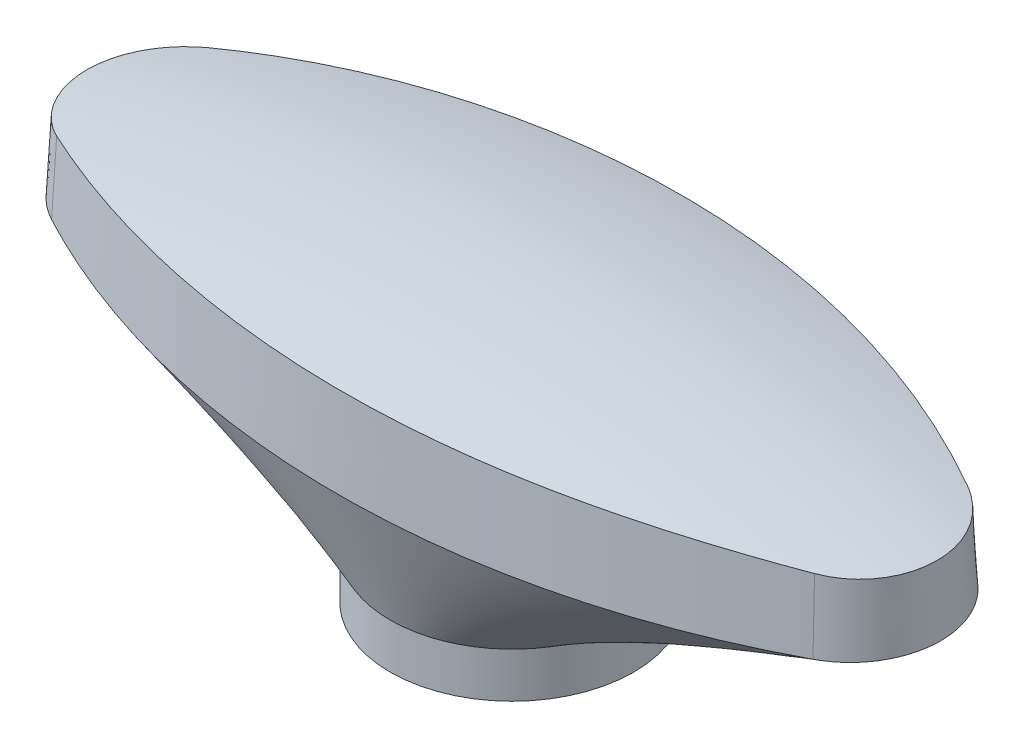
ISO-10303-21;
HEADER;
FILE_DESCRIPTION(('STEP AP214'),'2;1');
FILE_NAME('part.step','',(''),(''),'','','');
FILE_SCHEMA(('AUTOMOTIVE_DESIGN { 1 0 10303 214 1 1 1 1 }'));
ENDSEC;
DATA;
#1=APPLICATION_CONTEXT('core data for automotive mechanical design processes');
#2=APPLICATION_PROTOCOL_DEFINITION('international standard','automotive_design',2000,#1);
#3=PRODUCT_CONTEXT('',#1,'mechanical');
#4=PRODUCT('Part','Part','',(#3));
#5=PRODUCT_RELATED_PRODUCT_CATEGORY('part','',(#4));
#6=PRODUCT_DEFINITION_FORMATION('','',#4);
#7=PRODUCT_DEFINITION_CONTEXT('part definition',#1,'design');
#8=PRODUCT_DEFINITION('design','',#6,#7);
#9=PRODUCT_DEFINITION_SHAPE('','',#8);
#10=(LENGTH_UNIT() NAMED_UNIT(*) SI_UNIT(.MILLI.,.METRE.));
#11=(NAMED_UNIT(*) PLANE_ANGLE_UNIT() SI_UNIT($,.RADIAN.));
#12=(NAMED_UNIT(*) SI_UNIT($,.STERADIAN.) SOLID_ANGLE_UNIT());
#13=UNCERTAINTY_MEASURE_WITH_UNIT(LENGTH_MEASURE(1.E-05),#10,'distance_accuracy_value','');
#14=(GEOMETRIC_REPRESENTATION_CONTEXT(3) GLOBAL_UNCERTAINTY_ASSIGNED_CONTEXT((#13)) GLOBAL_UNIT_ASSIGNED_CONTEXT((#10,
#11,#12)) REPRESENTATION_CONTEXT('',''));
#15=CARTESIAN_POINT('',(0.,0.,0.));
#16=DIRECTION('',(0.,0.,1.));
#17=DIRECTION('',(1.,0.,0.));
#18=AXIS2_PLACEMENT_3D('',#15,#16,#17);
#19=CARTESIAN_POINT('',(0.,0.,70.6664701255128));
#20=DIRECTION('',(0.,-1.,0.));
#21=DIRECTION('',(0.,0.,-1.));
#22=AXIS2_PLACEMENT_3D('',#19,#20,#21);
#23=CONICAL_SURFACE('',#22,90.,0.05235987755983);
#24=CARTESIAN_POINT('',(42.1877,7.92334604528379,-8.36280484500249));
#25=CARTESIAN_POINT('',(41.0420861786236,8.04958269689081,-8.96689732359786));
#26=CARTESIAN_POINT('',(39.8827340055039,8.16554604480995,-9.54702712218328));
#27=CARTESIAN_POINT('',(37.5389979928671,8.37911484016454,-10.6578994137456));
#28=CARTESIAN_POINT('',(36.3546150847935,8.4767209693752,-11.1886437404968));
#29=CARTESIAN_POINT('',(33.9633622528988,8.65575922944964,-12.1992500164694));
#30=CARTESIAN_POINT('',(32.7564958381557,8.73719386150209,-12.6791198289132));
#31=CARTESIAN_POINT('',(30.3225011436141,8.88585861569262,-13.5868734879109));
#32=CARTESIAN_POINT('',(29.0953727194653,8.95308863658732,-14.0147569639229));
#33=CARTESIAN_POINT('',(26.6253632226318,9.07500112557227,-14.8168110909937));
#34=CARTESIAN_POINT('',(25.3825121254132,9.12970451328632,-15.191070897031));
#35=CARTESIAN_POINT('',(22.8814447587202,9.22824718567756,-15.8858501947194));
#36=CARTESIAN_POINT('',(21.6232283714051,9.27208638697934,-16.2063692739402));
#37=CARTESIAN_POINT('',(19.0939007457412,9.35022265419966,-16.7929149548736));
#38=CARTESIAN_POINT('',(17.8227898344565,9.38451996152011,-17.0589429351203));
#39=CARTESIAN_POINT('',(15.2700840785299,9.44467585432356,-17.5359110402673));
#40=CARTESIAN_POINT('',(13.9884893212943,9.47053451008813,-17.7468516239615));
#41=CARTESIAN_POINT('',(11.4721793320299,9.51374534987292,-18.1053504942601));
#42=CARTESIAN_POINT('',(10.2377997138021,9.53141367788286,-18.2552310707304));
#43=CARTESIAN_POINT('',(7.76382961184207,9.5603898825821,-18.5037746225482));
#44=CARTESIAN_POINT('',(6.52423918036235,9.57169782289894,-18.6024381102563));
#45=CARTESIAN_POINT('',(4.04200543142898,9.58833039245439,-18.748348738422));
#46=CARTESIAN_POINT('',(2.79936213473032,9.59365506225825,-18.7955962274687));
#47=CARTESIAN_POINT('',(0.313172689145865,9.59850173211197,-18.8385811807262));
#48=CARTESIAN_POINT('',(-0.930373460478781,9.59802372740787,-18.8343186027364));
#49=CARTESIAN_POINT('',(-3.41580439881277,9.59124994519686,-18.7743011758125));
#50=CARTESIAN_POINT('',(-4.65768959538659,9.58495605355588,-18.7185630184101));
#51=CARTESIAN_POINT('',(-7.13804462732119,9.56633988966191,-18.5557315805815));
#52=CARTESIAN_POINT('',(-8.37651444811628,9.55401759173923,-18.448638081478));
#53=CARTESIAN_POINT('',(-10.8478330074403,9.52293821688825,-18.1833140102447));
#54=CARTESIAN_POINT('',(-12.0806820419345,9.50418148282796,-18.025086162907));
#55=CARTESIAN_POINT('',(-14.5385798888697,9.45962556030004,-17.6578380420146));
#56=CARTESIAN_POINT('',(-15.7636288427861,9.43382649993838,-17.4488186924087));
#57=CARTESIAN_POINT('',(-19.1801673876014,9.35064667114176,-16.7929650810032));
#58=CARTESIAN_POINT('',(-21.3608596905224,9.28451113930283,-16.2896433459718));
#59=CARTESIAN_POINT('',(-25.6776417556003,9.12081285850867,-15.1230682261342));
#60=CARTESIAN_POINT('',(-27.8137362273662,9.02325344602767,-14.4598318223693));
#61=CARTESIAN_POINT('',(-30.9757417916052,8.84722554769212,-13.3484669747473));
#62=CARTESIAN_POINT('',(-32.0232083353522,8.78356415873686,-12.9583806984843));
#63=CARTESIAN_POINT('',(-34.1024464074495,8.64512584427489,-12.1400717156616));
#64=CARTESIAN_POINT('',(-35.1342180470989,8.57034899763302,-11.7118492796888));
#65=CARTESIAN_POINT('',(-37.1806981292641,8.40838401322045,-10.8179893569099));
#66=CARTESIAN_POINT('',(-38.1954027431913,8.32119313109879,-10.3523436069314));
#67=CARTESIAN_POINT('',(-40.2060266850643,8.13299027989981,-9.38464404720967));
#68=CARTESIAN_POINT('',(-41.2019455047049,8.0319779374507,-8.88258925408792));
#69=CARTESIAN_POINT('',(-42.1877,7.92334604528381,-8.36280484500249));
#70=B_SPLINE_CURVE_WITH_KNOTS('',3,(#24,#25,#26,#27,#28,#29,#30,#31,#32,#33,#34,#35,#36,#37,#38,
#39,#40,#41,#42,#43,#44,#45,#46,#47,#48,#49,#50,#51,#52,#53,#54,#55,#56,#57,#58,#59,#60,#61,#62,
#63,#64,#65,#66,#67,#68,#69),.UNSPECIFIED.,.F.,.F.,(4,2,2,2,2,2,2,2,2,2,2,2,2,2,2,2,2,2,2,2,2,2,
4),(0.,3.90342988146502,7.80671476343201,11.7093954670273,15.6121039860458,19.5082466156491,
23.4044191446294,27.3004930947505,31.1965345954763,34.9261746196312,38.6557773328494,
42.3853547600344,46.1149352427561,49.8433067918098,53.5716942168743,57.2998830004019,
61.028003969484,67.7383157719034,74.4479153323644,77.8059058012107,81.1638724460486,
84.522582587162,87.8813834781148),.UNSPECIFIED.);
#71=CARTESIAN_POINT('',(41.9923277296797,7.94476537095676,-8.46551848809129));
#72=VERTEX_POINT('',#71);
#73=CARTESIAN_POINT('',(-41.9923277296797,7.94476537095681,-8.46551848809126));
#74=VERTEX_POINT('',#73);
#75=EDGE_CURVE('E271',#72,#74,#70,.T.);
#76=ORIENTED_EDGE('',*,*,#75,.F.);
#77=DIRECTION('',(0.02453247948888,-0.998629534754574,-0.0462299661041518));
#78=VECTOR('',#77,1.);
#79=CARTESIAN_POINT('',(42.1875,0.,-8.83330876568912));
#80=LINE('',#79,#78);
#81=CARTESIAN_POINT('',(42.1875,0.,-8.83330876568911));
#82=VERTEX_POINT('',#81);
#83=EDGE_CURVE('E268',#72,#82,#80,.T.);
#84=ORIENTED_EDGE('',*,*,#83,.T.);
#85=CARTESIAN_POINT('',(-42.1874999995073,0.,8.83330876595053));
#86=CARTESIAN_POINT('',(-42.8507969057247,0.,8.48132240043696));
#87=CARTESIAN_POINT('',(-44.1697903268458,0.,7.59012209969732));
#88=CARTESIAN_POINT('',(-45.9301255882669,0.,5.61140300071321));
#89=CARTESIAN_POINT('',(-47.1903209527115,0.,3.00993284492601));
#90=CARTESIAN_POINT('',(-47.6555608380841,0.,0.));
#91=CARTESIAN_POINT('',(-47.1903209527115,0.,-3.00993284492602));
#92=CARTESIAN_POINT('',(-45.9301255882668,0.,-5.61140300071325));
#93=CARTESIAN_POINT('',(-44.1697903268459,0.,-7.59012209969734));
#94=CARTESIAN_POINT('',(-42.8507969057247,0.,-8.48132240043697));
#95=CARTESIAN_POINT('',(-38.8214849799809,0.,-10.6195245343064));
#96=CARTESIAN_POINT('',(-31.9722156021606,0.,-13.7082259749566));
#97=CARTESIAN_POINT('',(-21.4474636902119,0.,-16.9665499635177));
#98=CARTESIAN_POINT('',(-10.7635278317374,0.,-18.9062135992692));
#99=CARTESIAN_POINT('',(0.,0.,-19.5463803289425));
#100=CARTESIAN_POINT('',(10.7635278317374,0.,-18.9062135992692));
#101=CARTESIAN_POINT('',(21.4474636902119,0.,-16.9665499635177));
#102=CARTESIAN_POINT('',(31.9722156021605,0.,-13.7082259749565));
#103=CARTESIAN_POINT('',(38.8214849799809,0.,-10.6195245343064));
#104=CARTESIAN_POINT('',(42.8507969057247,0.,-8.48132240043698));
#105=CARTESIAN_POINT('',(44.1697903268458,0.,-7.59012209969733));
#106=CARTESIAN_POINT('',(45.9301255882669,0.,-5.61140300071325));
#107=CARTESIAN_POINT('',(47.1903209527115,0.,-3.00993284492602));
#108=CARTESIAN_POINT('',(47.6555608380841,0.,0.));
#109=CARTESIAN_POINT('',(47.1903209527116,0.,3.00993284492602));
#110=CARTESIAN_POINT('',(45.9301255882668,0.,5.61140300071325));
#111=CARTESIAN_POINT('',(44.1697903268459,0.,7.59012209969732));
#112=CARTESIAN_POINT('',(42.8507969057247,0.,8.48132240043696));
#113=CARTESIAN_POINT('',(38.8214849799809,0.,10.6195245343064));
#114=CARTESIAN_POINT('',(31.9722156021605,0.,13.7082259749566));
#115=CARTESIAN_POINT('',(21.4474636902119,0.,16.9665499635177));
#116=CARTESIAN_POINT('',(10.7635278317374,0.,18.9062135992692));
#117=CARTESIAN_POINT('',(0.,0.,19.5463803289425));
#118=CARTESIAN_POINT('',(-10.7635278317374,0.,18.9062135992692));
#119=CARTESIAN_POINT('',(-21.4474636902119,0.,16.9665499635177));
#120=CARTESIAN_POINT('',(-31.9722156021606,0.,13.7082259749565));
#121=CARTESIAN_POINT('',(-38.8214849799809,0.,10.6195245343064));
#122=CARTESIAN_POINT('',(-42.1874999995073,0.,8.83330876595053));
#123=B_SPLINE_CURVE_WITH_KNOTS('',3,(#85,#86,#87,#88,#89,#90,#91,#92,#93,#94,#95,#96,#97,#98,
#99,#100,#101,#102,#103,#104,#105,#106,#107,#108,#109,#110,#111,#112,#113,#114,#115,#116,#117,
#118,#119,#120,#121,#122),.UNSPECIFIED.,.T.,.F.,(4,1,1,1,1,1,1,1,2,1,1,1,1,1,1,1,2,1,1,1,1,1,1,
1,2,1,1,1,1,1,1,1,4),(0.,0.0102886193480629,0.0205772386961257,0.0308658580441886,
0.0411544773922514,0.0514430967403143,0.0617317160883771,0.07202033543644,0.0823089547845028,
0.13452033543644,0.186731716088377,0.238943096740314,0.291154477392251,0.343365858044189,
0.395577238696126,0.447788619348063,0.5,0.510288619348063,0.520577238696126,0.530865858044189,
0.541154477392251,0.551443096740314,0.561731716088377,0.57202033543644,0.582308954784503,
0.63452033543644,0.686731716088377,0.738943096740314,0.791154477392251,0.843365858044189,
0.895577238696126,0.947788619348063,1.),.UNSPECIFIED.);
#124=CARTESIAN_POINT('',(-42.1875,0.,-8.83330876568911));
#125=VERTEX_POINT('',#124);
#126=EDGE_CURVE('E249',#82,#125,#123,.F.);
#127=ORIENTED_EDGE('',*,*,#126,.T.);
#128=DIRECTION('',(-0.0245324794888799,-0.998629534754574,-0.0462299661041518));
#129=VECTOR('',#128,1.);
#130=CARTESIAN_POINT('',(-42.1875,0.,-8.83330876568911));
#131=LINE('',#130,#129);
#132=EDGE_CURVE('E259',#74,#125,#131,.T.);
#133=ORIENTED_EDGE('',*,*,#132,.F.);
#134=EDGE_LOOP('',(#76,#84,#127,#133));
#135=FACE_BOUND('',#134,.T.);
#136=ADVANCED_FACE('F199',(#135),#23,.T.);
#137=CARTESIAN_POINT('',(-37.5,0.,0.));
#138=DIRECTION('',(0.,-1.,0.));
#139=DIRECTION('',(0.,0.,1.));
#140=AXIS2_PLACEMENT_3D('',#137,#138,#139);
#141=CONICAL_SURFACE('',#140,9.99999999999999,0.05235987755983);
#142=CARTESIAN_POINT('',(-41.8925062415329,7.95570167815247,-8.51709547194581));
#143=CARTESIAN_POINT('',(-42.1300681517674,7.92954735364969,-8.39615452272569));
#144=CARTESIAN_POINT('',(-42.3626436491406,7.90481785962008,-8.26511924763189));
#145=CARTESIAN_POINT('',(-42.8161793767295,7.85813212993478,-7.98387939429463));
#146=CARTESIAN_POINT('',(-43.037140129971,7.83617576933902,-7.83367568027472));
#147=CARTESIAN_POINT('',(-43.4656526014798,7.79497419766811,-7.51523580023002));
#148=CARTESIAN_POINT('',(-43.6732150005767,7.77572681224842,-7.34701428930883));
#149=CARTESIAN_POINT('',(-44.0736146399296,7.73979629670361,-6.99363272453982));
#150=CARTESIAN_POINT('',(-44.2664520968245,7.72311312884908,-6.80847291998279));
#151=CARTESIAN_POINT('',(-44.6360926832641,7.69215207425028,-6.42242749536236));
#152=CARTESIAN_POINT('',(-44.8128879937249,7.677875357555,-6.22153429463598));
#153=CARTESIAN_POINT('',(-45.1490631720382,7.6515657429231,-5.80552524904044));
#154=CARTESIAN_POINT('',(-45.3084426371282,7.63953289687418,-5.59040907543224));
#155=CARTESIAN_POINT('',(-45.608605644863,7.61753358608686,-5.14753102528432));
#156=CARTESIAN_POINT('',(-45.7493926208203,7.6075667396442,-4.91977149454697));
#157=CARTESIAN_POINT('',(-46.0113967761716,7.58951732993934,-4.45319212441318));
#158=CARTESIAN_POINT('',(-46.1326140356696,7.58143475896425,-4.21437233029445));
#159=CARTESIAN_POINT('',(-46.3546993434934,7.56697870616053,-3.72718615994164));
#160=CARTESIAN_POINT('',(-46.4555521218126,7.56060650565787,-3.47881278500044));
#161=CARTESIAN_POINT('',(-46.6360775992234,7.54942702187067,-2.97445624071337));
#162=CARTESIAN_POINT('',(-46.7157507020391,7.54461970875608,-2.71847321652503));
#163=CARTESIAN_POINT('',(-46.8533681674698,7.53644195072707,-2.20066320518431));
#164=CARTESIAN_POINT('',(-46.9113088702661,7.5330717478144,-1.9388352415809));
#165=CARTESIAN_POINT('',(-47.0050346241284,7.52767302679568,-1.41122984277142));
#166=CARTESIAN_POINT('',(-47.0408196467792,7.52564451041037,-1.14545240250051));
#167=CARTESIAN_POINT('',(-47.0900436982005,7.5228645829313,-0.61116176211511));
#168=CARTESIAN_POINT('',(-47.103426881244,7.522116363397,-0.342643398913254));
#169=CARTESIAN_POINT('',(-47.10757983607,7.52188357757246,0.194569056985885));
#170=CARTESIAN_POINT('',(-47.0983495608008,7.5223990139115,0.463263150047643));
#171=CARTESIAN_POINT('',(-47.0573418178018,7.52470955842284,0.99890413632811));
#172=CARTESIAN_POINT('',(-47.0255656597198,7.52650459226576,1.26585113012358));
#173=CARTESIAN_POINT('',(-46.9396919145684,7.53142897212125,1.79611768540246));
#174=CARTESIAN_POINT('',(-46.8855943560148,7.53455831642923,2.05943725151952));
#175=CARTESIAN_POINT('',(-46.7554137681666,7.54224500089521,2.58076414091114));
#176=CARTESIAN_POINT('',(-46.6793150207045,7.54680336217361,2.8387675245098));
#177=CARTESIAN_POINT('',(-46.5056863026134,7.5574707822469,3.34743239660206));
#178=CARTESIAN_POINT('',(-46.4081559052765,7.56357987191741,3.59809373880173));
#179=CARTESIAN_POINT('',(-46.1923466751116,7.57749945970022,4.09031011608268));
#180=CARTESIAN_POINT('',(-46.0740651362758,7.58531017974211,4.33186395852294));
#181=CARTESIAN_POINT('',(-45.817613590127,7.602801743066,4.80409563287422));
#182=CARTESIAN_POINT('',(-45.679444015746,7.61248254564076,5.03477370138901));
#183=CARTESIAN_POINT('',(-45.384398619002,7.63388138649456,5.48331941269467));
#184=CARTESIAN_POINT('',(-45.2275467671645,7.64559682287228,5.70120294672348));
#185=CARTESIAN_POINT('',(-44.8961362817839,7.67125490944089,6.1229116732017));
#186=CARTESIAN_POINT('',(-44.7215780526448,7.68519750876876,6.32673718655014));
#187=CARTESIAN_POINT('',(-44.3561403952881,7.71547484888592,6.71874772258601));
#188=CARTESIAN_POINT('',(-44.1652718156536,7.73180800470772,6.90694297972566));
#189=CARTESIAN_POINT('',(-43.768579253182,7.76702268394483,7.26644369305907));
#190=CARTESIAN_POINT('',(-43.5627601657087,7.78590337492135,7.43775463490229));
#191=CARTESIAN_POINT('',(-43.1213199594787,7.82789997000117,7.77476916982298));
#192=CARTESIAN_POINT('',(-42.8846235498262,7.85122942080461,7.93904012493456));
#193=CARTESIAN_POINT('',(-42.398028091839,7.90105956995054,8.24511557423622));
#194=CARTESIAN_POINT('',(-42.1481530287144,7.92755461106825,8.38695912452816));
#195=CARTESIAN_POINT('',(-41.8925062415329,7.95570167815249,8.5170954719458));
#196=B_SPLINE_CURVE_WITH_KNOTS('',3,(#142,#143,#144,#145,#146,#147,#148,#149,#150,#151,#152,
#153,#154,#155,#156,#157,#158,#159,#160,#161,#162,#163,#164,#165,#166,#167,#168,#169,#170,#171,
#172,#173,#174,#175,#176,#177,#178,#179,#180,#181,#182,#183,#184,#185,#186,#187,#188,#189,#190,
#191,#192,#193,#194,#195),.UNSPECIFIED.,.F.,.F.,(4,2,2,2,2,2,2,2,2,2,2,2,2,2,2,2,2,2,2,2,2,2,2,
2,2,2,4),(0.,0.803323088646493,1.60660997165189,2.40924837819721,3.21187497374334,
4.01489069845783,4.81792498996314,5.62081078417847,6.42369329188834,7.22717561170496,
8.03064261455183,8.83424486360653,9.63784814329514,10.4434517647767,11.2490570624664,
12.0546155678879,12.860173044199,13.6663074579132,14.4724579233554,15.2787135913543,
16.0849517110638,16.8901663002532,17.6953625029175,18.5000272491227,19.3044296950167,
20.1703972713619,21.0348397961845),.UNSPECIFIED.);
#197=CARTESIAN_POINT('',(-41.9923277296797,7.94476537095679,8.46551848809128));
#198=VERTEX_POINT('',#197);
#199=EDGE_CURVE('E260',#74,#198,#196,.T.);
#200=ORIENTED_EDGE('',*,*,#199,.F.);
#201=ORIENTED_EDGE('',*,*,#132,.T.);
#202=CARTESIAN_POINT('',(-42.1874999995073,0.,8.83330876595053));
#203=CARTESIAN_POINT('',(-42.8507969057247,0.,8.48132240043696));
#204=CARTESIAN_POINT('',(-44.1697903268458,0.,7.59012209969732));
#205=CARTESIAN_POINT('',(-45.9301255882669,0.,5.61140300071321));
#206=CARTESIAN_POINT('',(-47.1903209527115,0.,3.00993284492601));
#207=CARTESIAN_POINT('',(-47.6555608380841,0.,0.));
#208=CARTESIAN_POINT('',(-47.1903209527115,0.,-3.00993284492602));
#209=CARTESIAN_POINT('',(-45.9301255882668,0.,-5.61140300071325));
#210=CARTESIAN_POINT('',(-44.1697903268459,0.,-7.59012209969734));
#211=CARTESIAN_POINT('',(-42.8507969057247,0.,-8.48132240043697));
#212=CARTESIAN_POINT('',(-38.8214849799809,0.,-10.6195245343064));
#213=CARTESIAN_POINT('',(-31.9722156021606,0.,-13.7082259749566));
#214=CARTESIAN_POINT('',(-21.4474636902119,0.,-16.9665499635177));
#215=CARTESIAN_POINT('',(-10.7635278317374,0.,-18.9062135992692));
#216=CARTESIAN_POINT('',(0.,0.,-19.5463803289425));
#217=CARTESIAN_POINT('',(10.7635278317374,0.,-18.9062135992692));
#218=CARTESIAN_POINT('',(21.4474636902119,0.,-16.9665499635177));
#219=CARTESIAN_POINT('',(31.9722156021606,0.,-13.7082259749566));
#220=CARTESIAN_POINT('',(38.8214849799809,0.,-10.6195245343064));
#221=CARTESIAN_POINT('',(42.8507969057247,0.,-8.48132240043698));
#222=CARTESIAN_POINT('',(44.1697903268458,0.,-7.59012209969733));
#223=CARTESIAN_POINT('',(45.9301255882669,0.,-5.61140300071326));
#224=CARTESIAN_POINT('',(47.1903209527115,0.,-3.00993284492602));
#225=CARTESIAN_POINT('',(47.6555608380841,0.,0.));
#226=CARTESIAN_POINT('',(47.1903209527116,0.,3.00993284492602));
#227=CARTESIAN_POINT('',(45.9301255882668,0.,5.61140300071326));
#228=CARTESIAN_POINT('',(44.1697903268459,0.,7.59012209969732));
#229=CARTESIAN_POINT('',(42.8507969057247,0.,8.48132240043697));
#230=CARTESIAN_POINT('',(38.8214849799809,0.,10.6195245343064));
#231=CARTESIAN_POINT('',(31.9722156021605,0.,13.7082259749566));
#232=CARTESIAN_POINT('',(21.4474636902119,0.,16.9665499635177));
#233=CARTESIAN_POINT('',(10.7635278317374,0.,18.9062135992692));
#234=CARTESIAN_POINT('',(0.,0.,19.5463803289425));
#235=CARTESIAN_POINT('',(-10.7635278317374,0.,18.9062135992692));
#236=CARTESIAN_POINT('',(-21.4474636902119,0.,16.9665499635177));
#237=CARTESIAN_POINT('',(-31.9722156021606,0.,13.7082259749565));
#238=CARTESIAN_POINT('',(-38.8214849799809,0.,10.6195245343064));
#239=CARTESIAN_POINT('',(-42.1874999995073,0.,8.83330876595053));
#240=B_SPLINE_CURVE_WITH_KNOTS('',3,(#202,#203,#204,#205,#206,#207,#208,#209,#210,#211,#212,
#213,#214,#215,#216,#217,#218,#219,#220,#221,#222,#223,#224,#225,#226,#227,#228,#229,#230,#231,
#232,#233,#234,#235,#236,#237,#238,#239),.UNSPECIFIED.,.T.,.F.,(4,1,1,1,1,1,1,1,2,1,1,1,1,1,1,1,
2,1,1,1,1,1,1,1,2,1,1,1,1,1,1,1,4),(0.,0.0102886193480629,0.0205772386961257,0.0308658580441886,
0.0411544773922514,0.0514430967403143,0.0617317160883771,0.07202033543644,0.0823089547845028,
0.13452033543644,0.186731716088377,0.238943096740314,0.291154477392251,0.343365858044189,
0.395577238696126,0.447788619348063,0.5,0.510288619348063,0.520577238696126,0.530865858044189,
0.541154477392251,0.551443096740314,0.561731716088377,0.57202033543644,0.582308954784503,
0.63452033543644,0.686731716088377,0.738943096740314,0.791154477392251,0.843365858044189,
0.895577238696126,0.947788619348063,1.),.UNSPECIFIED.);
#241=CARTESIAN_POINT('',(-42.1875,0.,8.8333087656891));
#242=VERTEX_POINT('',#241);
#243=EDGE_CURVE('E243',#125,#242,#240,.F.);
#244=ORIENTED_EDGE('',*,*,#243,.T.);
#245=DIRECTION('',(-0.02453247948888,-0.998629534754574,0.0462299661041518));
#246=VECTOR('',#245,1.);
#247=CARTESIAN_POINT('',(-42.1875,0.,8.83330876568911));
#248=LINE('',#247,#246);
#249=EDGE_CURVE('E264',#198,#242,#248,.T.);
#250=ORIENTED_EDGE('',*,*,#249,.F.);
#251=EDGE_LOOP('',(#200,#201,#244,#250));
#252=FACE_BOUND('',#251,.T.);
#253=ADVANCED_FACE('F201',(#252),#141,.T.);
#254=CARTESIAN_POINT('',(0.,0.,-70.6664701255129));
#255=DIRECTION('',(0.,-1.,0.));
#256=DIRECTION('',(0.,0.,1.));
#257=AXIS2_PLACEMENT_3D('',#254,#255,#256);
#258=CONICAL_SURFACE('',#257,90.,0.05235987755983);
#259=CARTESIAN_POINT('',(-42.1877,7.92334604528384,8.36280484500247));
#260=CARTESIAN_POINT('',(-41.0420861786236,8.04958269689082,8.96689732359786));
#261=CARTESIAN_POINT('',(-39.8827340055039,8.16554604480996,9.54702712218328));
#262=CARTESIAN_POINT('',(-37.5389979928671,8.37911484016456,10.6578994137456));
#263=CARTESIAN_POINT('',(-36.3546150847935,8.47672096937523,11.1886437404968));
#264=CARTESIAN_POINT('',(-33.9633622528988,8.65575922944966,12.1992500164694));
#265=CARTESIAN_POINT('',(-32.7564958381557,8.73719386150208,12.6791198289132));
#266=CARTESIAN_POINT('',(-30.3225011436141,8.88585861569258,13.5868734879109));
#267=CARTESIAN_POINT('',(-29.0953727194653,8.95308863658727,14.0147569639229));
#268=CARTESIAN_POINT('',(-26.6253632226318,9.07500112557222,14.8168110909937));
#269=CARTESIAN_POINT('',(-25.3825121254132,9.1297045132863,15.191070897031));
#270=CARTESIAN_POINT('',(-22.8814447587202,9.22824718567757,15.8858501947194));
#271=CARTESIAN_POINT('',(-21.6232283714051,9.27208638697936,16.2063692739402));
#272=CARTESIAN_POINT('',(-19.0939007457412,9.3502226541997,16.7929149548735));
#273=CARTESIAN_POINT('',(-17.8227898344565,9.38451996152014,17.0589429351203));
#274=CARTESIAN_POINT('',(-15.2700840785299,9.44467585432358,17.5359110402673));
#275=CARTESIAN_POINT('',(-13.9884893212943,9.47053451008812,17.7468516239615));
#276=CARTESIAN_POINT('',(-11.4721793320299,9.51374534987293,18.1053504942601));
#277=CARTESIAN_POINT('',(-10.2377997138021,9.53141367788291,18.2552310707304));
#278=CARTESIAN_POINT('',(-7.76382961184208,9.56038988258216,18.5037746225482));
#279=CARTESIAN_POINT('',(-6.52423918036236,9.57169782289896,18.6024381102563));
#280=CARTESIAN_POINT('',(-4.04200543142899,9.58833039245438,18.748348738422));
#281=CARTESIAN_POINT('',(-2.79936213473033,9.59365506225824,18.7955962274687));
#282=CARTESIAN_POINT('',(-0.313172689145881,9.59850173211198,18.8385811807262));
#283=CARTESIAN_POINT('',(0.930373460478764,9.59802372740787,18.8343186027364));
#284=CARTESIAN_POINT('',(3.41580439881275,9.59124994519686,18.7743011758125));
#285=CARTESIAN_POINT('',(4.65768959538657,9.58495605355588,18.7185630184101));
#286=CARTESIAN_POINT('',(7.13804462732117,9.56633988966193,18.5557315805815));
#287=CARTESIAN_POINT('',(8.37651444811626,9.55401759173924,18.448638081478));
#288=CARTESIAN_POINT('',(10.8478330074402,9.52293821688826,18.1833140102447));
#289=CARTESIAN_POINT('',(12.0806820419344,9.50418148282798,18.025086162907));
#290=CARTESIAN_POINT('',(14.5385798888697,9.45962556030006,17.6578380420146));
#291=CARTESIAN_POINT('',(15.7636288427861,9.4338264999384,17.4488186924087));
#292=CARTESIAN_POINT('',(19.1801673876013,9.35064667114179,16.7929650810032));
#293=CARTESIAN_POINT('',(21.3608596905223,9.28451113930291,16.2896433459718));
#294=CARTESIAN_POINT('',(25.6776417556003,9.12081285850871,15.1230682261342));
#295=CARTESIAN_POINT('',(27.8137362273662,9.02325344602761,14.4598318223693));
#296=CARTESIAN_POINT('',(30.9757417916052,8.8472255476921,13.3484669747473));
#297=CARTESIAN_POINT('',(32.0232083353522,8.78356415873689,12.9583806984843));
#298=CARTESIAN_POINT('',(34.1024464074495,8.64512584427493,12.1400717156615));
#299=CARTESIAN_POINT('',(35.1342180470989,8.57034899763303,11.7118492796888));
#300=CARTESIAN_POINT('',(37.1806981292641,8.40838401322045,10.8179893569099));
#301=CARTESIAN_POINT('',(38.1954027431913,8.3211931310988,10.3523436069313));
#302=CARTESIAN_POINT('',(40.2060266850643,8.13299027989985,9.38464404720965));
#303=CARTESIAN_POINT('',(41.2019455047049,8.03197793745075,8.88258925408789));
#304=CARTESIAN_POINT('',(42.1877,7.92334604528383,8.36280484500247));
#305=B_SPLINE_CURVE_WITH_KNOTS('',3,(#259,#260,#261,#262,#263,#264,#265,#266,#267,#268,#269,
#270,#271,#272,#273,#274,#275,#276,#277,#278,#279,#280,#281,#282,#283,#284,#285,#286,#287,#288,
#289,#290,#291,#292,#293,#294,#295,#296,#297,#298,#299,#300,#301,#302,#303,#304),.UNSPECIFIED.,
.F.,.F.,(4,2,2,2,2,2,2,2,2,2,2,2,2,2,2,2,2,2,2,2,2,2,4),(0.,3.90342988146503,7.80671476343201,
11.7093954670273,15.6121039860458,19.5082466156491,23.4044191446294,27.3004930947505,
31.1965345954763,34.9261746196312,38.6557773328494,42.3853547600344,46.1149352427561,
49.8433067918098,53.5716942168742,57.2998830004019,61.028003969484,67.7383157719034,
74.4479153323644,77.8059058012107,81.1638724460486,84.5225825871619,87.8813834781148),.UNSPECIFIED.);
#306=CARTESIAN_POINT('',(41.9923277296797,7.94476537095684,8.46551848809126));
#307=VERTEX_POINT('',#306);
#308=EDGE_CURVE('E378',#198,#307,#305,.T.);
#309=ORIENTED_EDGE('',*,*,#308,.F.);
#310=ORIENTED_EDGE('',*,*,#249,.T.);
#311=CARTESIAN_POINT('',(-42.1874999995073,0.,8.83330876595053));
#312=CARTESIAN_POINT('',(-42.8507969057247,0.,8.48132240043696));
#313=CARTESIAN_POINT('',(-44.1697903268458,0.,7.59012209969732));
#314=CARTESIAN_POINT('',(-45.9301255882669,0.,5.61140300071321));
#315=CARTESIAN_POINT('',(-47.1903209527115,0.,3.00993284492601));
#316=CARTESIAN_POINT('',(-47.6555608380841,0.,0.));
#317=CARTESIAN_POINT('',(-47.1903209527115,0.,-3.00993284492602));
#318=CARTESIAN_POINT('',(-45.9301255882668,0.,-5.61140300071325));
#319=CARTESIAN_POINT('',(-44.1697903268459,0.,-7.59012209969734));
#320=CARTESIAN_POINT('',(-42.8507969057247,0.,-8.48132240043697));
#321=CARTESIAN_POINT('',(-38.8214849799809,0.,-10.6195245343064));
#322=CARTESIAN_POINT('',(-31.9722156021606,0.,-13.7082259749566));
#323=CARTESIAN_POINT('',(-21.4474636902119,0.,-16.9665499635177));
#324=CARTESIAN_POINT('',(-10.7635278317374,0.,-18.9062135992692));
#325=CARTESIAN_POINT('',(0.,0.,-19.5463803289425));
#326=CARTESIAN_POINT('',(10.7635278317374,0.,-18.9062135992692));
#327=CARTESIAN_POINT('',(21.4474636902119,0.,-16.9665499635177));
#328=CARTESIAN_POINT('',(31.9722156021606,0.,-13.7082259749566));
#329=CARTESIAN_POINT('',(38.8214849799809,0.,-10.6195245343064));
#330=CARTESIAN_POINT('',(42.8507969057247,0.,-8.48132240043698));
#331=CARTESIAN_POINT('',(44.1697903268458,0.,-7.59012209969733));
#332=CARTESIAN_POINT('',(45.9301255882669,0.,-5.61140300071326));
#333=CARTESIAN_POINT('',(47.1903209527115,0.,-3.00993284492602));
#334=CARTESIAN_POINT('',(47.6555608380841,0.,0.));
#335=CARTESIAN_POINT('',(47.1903209527116,0.,3.00993284492602));
#336=CARTESIAN_POINT('',(45.9301255882668,0.,5.61140300071326));
#337=CARTESIAN_POINT('',(44.1697903268459,0.,7.59012209969732));
#338=CARTESIAN_POINT('',(42.8507969057247,0.,8.48132240043697));
#339=CARTESIAN_POINT('',(38.8214849799809,0.,10.6195245343064));
#340=CARTESIAN_POINT('',(31.9722156021605,0.,13.7082259749566));
#341=CARTESIAN_POINT('',(21.4474636902119,0.,16.9665499635177));
#342=CARTESIAN_POINT('',(10.7635278317374,0.,18.9062135992692));
#343=CARTESIAN_POINT('',(0.,0.,19.5463803289425));
#344=CARTESIAN_POINT('',(-10.7635278317374,0.,18.9062135992692));
#345=CARTESIAN_POINT('',(-21.4474636902119,0.,16.9665499635177));
#346=CARTESIAN_POINT('',(-31.9722156021606,0.,13.7082259749565));
#347=CARTESIAN_POINT('',(-38.8214849799809,0.,10.6195245343064));
#348=CARTESIAN_POINT('',(-42.1874999995073,0.,8.83330876595053));
#349=B_SPLINE_CURVE_WITH_KNOTS('',3,(#311,#312,#313,#314,#315,#316,#317,#318,#319,#320,#321,
#322,#323,#324,#325,#326,#327,#328,#329,#330,#331,#332,#333,#334,#335,#336,#337,#338,#339,#340,
#341,#342,#343,#344,#345,#346,#347,#348),.UNSPECIFIED.,.T.,.F.,(4,1,1,1,1,1,1,1,2,1,1,1,1,1,1,1,
2,1,1,1,1,1,1,1,2,1,1,1,1,1,1,1,4),(0.,0.0102886193480629,0.0205772386961257,0.0308658580441886,
0.0411544773922514,0.0514430967403143,0.0617317160883771,0.07202033543644,0.0823089547845028,
0.13452033543644,0.186731716088377,0.238943096740314,0.291154477392251,0.343365858044189,
0.395577238696126,0.447788619348063,0.5,0.510288619348063,0.520577238696126,0.530865858044189,
0.541154477392251,0.551443096740314,0.561731716088377,0.57202033543644,0.582308954784503,
0.63452033543644,0.686731716088377,0.738943096740314,0.791154477392251,0.843365858044189,
0.895577238696126,0.947788619348063,1.),.UNSPECIFIED.);
#350=CARTESIAN_POINT('',(42.1875,0.,8.83330876568911));
#351=VERTEX_POINT('',#350);
#352=EDGE_CURVE('E218',#242,#351,#349,.F.);
#353=ORIENTED_EDGE('',*,*,#352,.T.);
#354=DIRECTION('',(0.0245324794888799,-0.998629534754574,0.0462299661041519));
#355=VECTOR('',#354,1.);
#356=CARTESIAN_POINT('',(42.1875,0.,8.8333087656891));
#357=LINE('',#356,#355);
#358=EDGE_CURVE('E398',#307,#351,#357,.T.);
#359=ORIENTED_EDGE('',*,*,#358,.F.);
#360=EDGE_LOOP('',(#309,#310,#353,#359));
#361=FACE_BOUND('',#360,.T.);
#362=ADVANCED_FACE('F385',(#361),#258,.T.);
#363=CARTESIAN_POINT('',(37.5,0.,0.));
#364=DIRECTION('',(0.,-1.,0.));
#365=DIRECTION('',(0.,0.,1.));
#366=AXIS2_PLACEMENT_3D('',#363,#364,#365);
#367=CONICAL_SURFACE('',#366,10.,0.05235987755983);
#368=CARTESIAN_POINT('',(41.8925062415329,7.9557016781525,8.51709547194579));
#369=CARTESIAN_POINT('',(42.1300681517674,7.92954735364967,8.39615452272568));
#370=CARTESIAN_POINT('',(42.3626436491406,7.90481785962006,8.26511924763189));
#371=CARTESIAN_POINT('',(42.8161793767295,7.85813212993476,7.98387939429462));
#372=CARTESIAN_POINT('',(43.037140129971,7.83617576933901,7.83367568027471));
#373=CARTESIAN_POINT('',(43.4656526014798,7.79497419766808,7.51523580023002));
#374=CARTESIAN_POINT('',(43.6732150005767,7.77572681224835,7.34701428930883));
#375=CARTESIAN_POINT('',(44.0736146399296,7.73979629670357,6.99363272453982));
#376=CARTESIAN_POINT('',(44.2664520968245,7.7231131288491,6.80847291998278));
#377=CARTESIAN_POINT('',(44.6360926832641,7.69215207425032,6.42242749536235));
#378=CARTESIAN_POINT('',(44.8128879937249,7.67787535755501,6.22153429463597));
#379=CARTESIAN_POINT('',(45.1490631720382,7.6515657429231,5.80552524904043));
#380=CARTESIAN_POINT('',(45.3084426371282,7.63953289687421,5.59040907543223));
#381=CARTESIAN_POINT('',(45.608605644863,7.61753358608688,5.14753102528431));
#382=CARTESIAN_POINT('',(45.7493926208203,7.6075667396442,4.91977149454696));
#383=CARTESIAN_POINT('',(46.0113967761716,7.58951732993934,4.45319212441317));
#384=CARTESIAN_POINT('',(46.1326140356696,7.58143475896427,4.21437233029444));
#385=CARTESIAN_POINT('',(46.3546993434934,7.56697870616057,3.72718615994162));
#386=CARTESIAN_POINT('',(46.4555521218126,7.5606065056579,3.47881278500043));
#387=CARTESIAN_POINT('',(46.6360775992234,7.54942702187069,2.97445624071336));
#388=CARTESIAN_POINT('',(46.7157507020391,7.54461970875609,2.71847321652502));
#389=CARTESIAN_POINT('',(46.8533681674698,7.53644195072706,2.2006632051843));
#390=CARTESIAN_POINT('',(46.9113088702661,7.53307174781438,1.93883524158089));
#391=CARTESIAN_POINT('',(47.0050346241284,7.52767302679567,1.41122984277141));
#392=CARTESIAN_POINT('',(47.0408196467793,7.52564451041039,1.1454524025005));
#393=CARTESIAN_POINT('',(47.0900436982005,7.52286458293134,0.611161762115097));
#394=CARTESIAN_POINT('',(47.103426881244,7.52211636339702,0.342643398913241));
#395=CARTESIAN_POINT('',(47.10757983607,7.52188357757246,-0.194569056985898));
#396=CARTESIAN_POINT('',(47.0983495608008,7.5223990139115,-0.463263150047656));
#397=CARTESIAN_POINT('',(47.0573418178018,7.52470955842283,-0.998904136328122));
#398=CARTESIAN_POINT('',(47.0255656597199,7.52650459226573,-1.26585113012359));
#399=CARTESIAN_POINT('',(46.9396919145684,7.53142897212122,-1.79611768540247));
#400=CARTESIAN_POINT('',(46.8855943560148,7.53455831642919,-2.05943725151954));
#401=CARTESIAN_POINT('',(46.7554137681666,7.54224500089518,-2.58076414091115));
#402=CARTESIAN_POINT('',(46.6793150207045,7.5468033621736,-2.83876752450981));
#403=CARTESIAN_POINT('',(46.5056863026134,7.55747078224691,-3.34743239660207));
#404=CARTESIAN_POINT('',(46.4081559052765,7.56357987191744,-3.59809373880174));
#405=CARTESIAN_POINT('',(46.1923466751116,7.57749945970024,-4.09031011608269));
#406=CARTESIAN_POINT('',(46.0740651362758,7.58531017974211,-4.33186395852295));
#407=CARTESIAN_POINT('',(45.817613590127,7.60280174306601,-4.80409563287424));
#408=CARTESIAN_POINT('',(45.679444015746,7.61248254564079,-5.03477370138903));
#409=CARTESIAN_POINT('',(45.384398619002,7.63388138649459,-5.48331941269468));
#410=CARTESIAN_POINT('',(45.2275467671645,7.64559682287229,-5.70120294672349));
#411=CARTESIAN_POINT('',(44.8961362817839,7.67125490944088,-6.12291167320173));
#412=CARTESIAN_POINT('',(44.7215780526448,7.68519750876877,-6.32673718655017));
#413=CARTESIAN_POINT('',(44.3561403952881,7.71547484888593,-6.71874772258603));
#414=CARTESIAN_POINT('',(44.1652718156536,7.73180800470772,-6.90694297972568));
#415=CARTESIAN_POINT('',(43.768579253182,7.76702268394484,-7.26644369305908));
#416=CARTESIAN_POINT('',(43.5627601657087,7.78590337492138,-7.4377546349023));
#417=CARTESIAN_POINT('',(43.1213199594787,7.82789997000119,-7.774769169823));
#418=CARTESIAN_POINT('',(42.8846235498262,7.8512294208046,-7.93904012493458));
#419=CARTESIAN_POINT('',(42.3980280918391,7.90105956995049,-8.24511557423624));
#420=CARTESIAN_POINT('',(42.1481530287145,7.9275546110682,-8.38695912452818));
#421=CARTESIAN_POINT('',(41.8925062415329,7.95570167815251,-8.51709547194581));
#422=B_SPLINE_CURVE_WITH_KNOTS('',3,(#368,#369,#370,#371,#372,#373,#374,#375,#376,#377,#378,
#379,#380,#381,#382,#383,#384,#385,#386,#387,#388,#389,#390,#391,#392,#393,#394,#395,#396,#397,
#398,#399,#400,#401,#402,#403,#404,#405,#406,#407,#408,#409,#410,#411,#412,#413,#414,#415,#416,
#417,#418,#419,#420,#421),.UNSPECIFIED.,.F.,.F.,(4,2,2,2,2,2,2,2,2,2,2,2,2,2,2,2,2,2,2,2,2,2,2,
2,2,2,4),(0.,0.803323088646496,1.6066099716519,2.4092483781972,3.21187497374335,
4.01489069845784,4.81792498996314,5.62081078417847,6.42369329188835,7.22717561170496,
8.03064261455183,8.83424486360653,9.63784814329514,10.4434517647767,11.2490570624665,
12.0546155678879,12.860173044199,13.6663074579132,14.4724579233554,15.2787135913543,
16.0849517110639,16.8901663002532,17.6953625029175,18.5000272491227,19.3044296950167,
20.1703972713619,21.0348397961845),.UNSPECIFIED.);
#423=EDGE_CURVE('E211',#307,#72,#422,.T.);
#424=ORIENTED_EDGE('',*,*,#423,.F.);
#425=ORIENTED_EDGE('',*,*,#358,.T.);
#426=CARTESIAN_POINT('',(-42.1874999995073,0.,8.83330876595053));
#427=CARTESIAN_POINT('',(-42.8507969057247,0.,8.48132240043696));
#428=CARTESIAN_POINT('',(-44.1697903268458,0.,7.59012209969732));
#429=CARTESIAN_POINT('',(-45.9301255882669,0.,5.61140300071321));
#430=CARTESIAN_POINT('',(-47.1903209527115,0.,3.00993284492601));
#431=CARTESIAN_POINT('',(-47.6555608380841,0.,0.));
#432=CARTESIAN_POINT('',(-47.1903209527115,0.,-3.00993284492602));
#433=CARTESIAN_POINT('',(-45.9301255882668,0.,-5.61140300071325));
#434=CARTESIAN_POINT('',(-44.1697903268459,0.,-7.59012209969734));
#435=CARTESIAN_POINT('',(-42.8507969057247,0.,-8.48132240043697));
#436=CARTESIAN_POINT('',(-38.8214849799809,0.,-10.6195245343064));
#437=CARTESIAN_POINT('',(-31.9722156021606,0.,-13.7082259749566));
#438=CARTESIAN_POINT('',(-21.4474636902119,0.,-16.9665499635177));
#439=CARTESIAN_POINT('',(-10.7635278317374,0.,-18.9062135992692));
#440=CARTESIAN_POINT('',(0.,0.,-19.5463803289425));
#441=CARTESIAN_POINT('',(10.7635278317374,0.,-18.9062135992692));
#442=CARTESIAN_POINT('',(21.4474636902119,0.,-16.9665499635177));
#443=CARTESIAN_POINT('',(31.9722156021606,0.,-13.7082259749566));
#444=CARTESIAN_POINT('',(38.8214849799809,0.,-10.6195245343064));
#445=CARTESIAN_POINT('',(42.8507969057247,0.,-8.48132240043698));
#446=CARTESIAN_POINT('',(44.1697903268458,0.,-7.59012209969733));
#447=CARTESIAN_POINT('',(45.9301255882669,0.,-5.61140300071326));
#448=CARTESIAN_POINT('',(47.1903209527115,0.,-3.00993284492602));
#449=CARTESIAN_POINT('',(47.6555608380841,0.,0.));
#450=CARTESIAN_POINT('',(47.1903209527116,0.,3.00993284492602));
#451=CARTESIAN_POINT('',(45.9301255882668,0.,5.61140300071326));
#452=CARTESIAN_POINT('',(44.1697903268459,0.,7.59012209969732));
#453=CARTESIAN_POINT('',(42.8507969057247,0.,8.48132240043697));
#454=CARTESIAN_POINT('',(38.8214849799809,0.,10.6195245343064));
#455=CARTESIAN_POINT('',(31.9722156021605,0.,13.7082259749566));
#456=CARTESIAN_POINT('',(21.4474636902119,0.,16.9665499635177));
#457=CARTESIAN_POINT('',(10.7635278317374,0.,18.9062135992692));
#458=CARTESIAN_POINT('',(0.,0.,19.5463803289425));
#459=CARTESIAN_POINT('',(-10.7635278317374,0.,18.9062135992692));
#460=CARTESIAN_POINT('',(-21.4474636902119,0.,16.9665499635177));
#461=CARTESIAN_POINT('',(-31.9722156021606,0.,13.7082259749565));
#462=CARTESIAN_POINT('',(-38.8214849799809,0.,10.6195245343064));
#463=CARTESIAN_POINT('',(-42.1874999995073,0.,8.83330876595053));
#464=B_SPLINE_CURVE_WITH_KNOTS('',3,(#426,#427,#428,#429,#430,#431,#432,#433,#434,#435,#436,
#437,#438,#439,#440,#441,#442,#443,#444,#445,#446,#447,#448,#449,#450,#451,#452,#453,#454,#455,
#456,#457,#458,#459,#460,#461,#462,#463),.UNSPECIFIED.,.T.,.F.,(4,1,1,1,1,1,1,1,2,1,1,1,1,1,1,1,
2,1,1,1,1,1,1,1,2,1,1,1,1,1,1,1,4),(0.,0.0102886193480629,0.0205772386961257,0.0308658580441886,
0.0411544773922514,0.0514430967403143,0.0617317160883771,0.07202033543644,0.0823089547845028,
0.13452033543644,0.186731716088377,0.238943096740314,0.291154477392251,0.343365858044189,
0.395577238696126,0.447788619348063,0.5,0.510288619348063,0.520577238696126,0.530865858044189,
0.541154477392251,0.551443096740314,0.561731716088377,0.57202033543644,0.582308954784503,
0.63452033543644,0.686731716088377,0.738943096740314,0.791154477392251,0.843365858044189,
0.895577238696126,0.947788619348063,1.),.UNSPECIFIED.);
#465=EDGE_CURVE('E404',#351,#82,#464,.F.);
#466=ORIENTED_EDGE('',*,*,#465,.T.);
#467=ORIENTED_EDGE('',*,*,#83,.F.);
#468=EDGE_LOOP('',(#424,#425,#466,#467));
#469=FACE_BOUND('',#468,.T.);
#470=ADVANCED_FACE('F292',(#469),#367,.T.);
#471=CARTESIAN_POINT('',(0.,-63.,0.));
#472=DIRECTION('',(-1.,0.,0.));
#473=DIRECTION('',(0.,0.,1.));
#474=AXIS2_PLACEMENT_3D('',#471,#472,#473);
#475=DEGENERATE_TOROIDAL_SURFACE('',#474,175.,250.,.F.);
#476=CARTESIAN_POINT('',(0.,12.,0.));
#477=VERTEX_POINT('',#476);
#478=VERTEX_LOOP('',#477);
#479=FACE_BOUND('',#478,.T.);
#480=ORIENTED_EDGE('',*,*,#75,.T.);
#481=ORIENTED_EDGE('',*,*,#199,.T.);
#482=ORIENTED_EDGE('',*,*,#308,.T.);
#483=ORIENTED_EDGE('',*,*,#423,.T.);
#484=EDGE_LOOP('',(#480,#481,#482,#483));
#485=FACE_BOUND('',#484,.T.);
#486=ADVANCED_FACE('F289',(#479,#485),#475,.F.);
#487=CARTESIAN_POINT('',(-42.1874999995073,0.,8.83330876595053));
#488=CARTESIAN_POINT('',(-13.2134619472652,-15.,2.76666285769966));
#489=CARTESIAN_POINT('',(-42.8507969057247,0.,8.48132240043696));
#490=CARTESIAN_POINT('',(-13.2730791985779,-15.,2.48193344808981));
#491=CARTESIAN_POINT('',(-44.1697903268458,0.,7.59012209969732));
#492=CARTESIAN_POINT('',(-13.364237239991,-15.,1.96514807463479));
#493=CARTESIAN_POINT('',(-45.9301255882669,0.,5.61140300071321));
#494=CARTESIAN_POINT('',(-13.4430108925904,-15.,1.28439963031424));
#495=CARTESIAN_POINT('',(-47.1903209527115,0.,3.00993284492601));
#496=CARTESIAN_POINT('',(-13.490087107923,-15.,0.634490089324433));
#497=CARTESIAN_POINT('',(-47.6555608380841,0.,0.));
#498=CARTESIAN_POINT('',(-13.5057008562727,-15.,0.));
#499=CARTESIAN_POINT('',(-47.1903209527115,0.,-3.00993284492602));
#500=CARTESIAN_POINT('',(-13.490087107923,-15.,-0.63449008932444));
#501=CARTESIAN_POINT('',(-45.9301255882668,0.,-5.61140300071325));
#502=CARTESIAN_POINT('',(-13.4430108925904,-15.,-1.28439963031425));
#503=CARTESIAN_POINT('',(-44.1697903268459,0.,-7.59012209969734));
#504=CARTESIAN_POINT('',(-13.364237239991,-15.,-1.96514807463479));
#505=CARTESIAN_POINT('',(-42.8507969057247,0.,-8.48132240043697));
#506=CARTESIAN_POINT('',(-13.2730791985779,-15.,-2.48193344808981));
#507=CARTESIAN_POINT('',(-38.8214849799809,0.,-10.6195245343064));
#508=CARTESIAN_POINT('',(-12.9109238810379,-15.,-4.21157155584682));
#509=CARTESIAN_POINT('',(-31.9722156021606,0.,-13.7082259749566));
#510=CARTESIAN_POINT('',(-11.8184070664668,-15.,-7.04283250434103));
#511=CARTESIAN_POINT('',(-21.4474636902119,0.,-16.9665499635177));
#512=CARTESIAN_POINT('',(-8.79893159903337,-15.,-10.5890543612832));
#513=CARTESIAN_POINT('',(-10.7635278317374,0.,-18.9062135992692));
#514=CARTESIAN_POINT('',(-4.69778205585336,-15.,-12.9482862389093));
#515=CARTESIAN_POINT('',(0.,0.,-19.5463803289425));
#516=CARTESIAN_POINT('',(0.,-15.,-13.776419090779));
#517=CARTESIAN_POINT('',(10.7635278317374,0.,-18.9062135992692));
#518=CARTESIAN_POINT('',(4.69778205585336,-15.,-12.9482862389093));
#519=CARTESIAN_POINT('',(21.4474636902119,0.,-16.9665499635177));
#520=CARTESIAN_POINT('',(8.79893159903338,-15.,-10.5890543612832));
#521=CARTESIAN_POINT('',(31.9722156021606,0.,-13.7082259749566));
#522=CARTESIAN_POINT('',(11.8184070664668,-15.,-7.04283250434106));
#523=CARTESIAN_POINT('',(38.8214849799809,0.,-10.6195245343064));
#524=CARTESIAN_POINT('',(12.9109238810379,-15.,-4.21157155584682));
#525=CARTESIAN_POINT('',(42.8507969057247,0.,-8.48132240043698));
#526=CARTESIAN_POINT('',(13.2730791985779,-15.,-2.48193344808982));
#527=CARTESIAN_POINT('',(44.1697903268458,0.,-7.59012209969733));
#528=CARTESIAN_POINT('',(13.364237239991,-15.,-1.9651480746348));
#529=CARTESIAN_POINT('',(45.9301255882669,0.,-5.61140300071326));
#530=CARTESIAN_POINT('',(13.4430108925904,-15.,-1.28439963031425));
#531=CARTESIAN_POINT('',(47.1903209527115,0.,-3.00993284492602));
#532=CARTESIAN_POINT('',(13.490087107923,-15.,-0.634490089324438));
#533=CARTESIAN_POINT('',(47.6555608380841,0.,0.));
#534=CARTESIAN_POINT('',(13.5057008562727,-15.,0.));
#535=CARTESIAN_POINT('',(47.1903209527116,0.,3.00993284492602));
#536=CARTESIAN_POINT('',(13.490087107923,-15.,0.63449008932444));
#537=CARTESIAN_POINT('',(45.9301255882668,0.,5.61140300071326));
#538=CARTESIAN_POINT('',(13.4430108925904,-15.,1.28439963031425));
#539=CARTESIAN_POINT('',(44.1697903268459,0.,7.59012209969732));
#540=CARTESIAN_POINT('',(13.364237239991,-15.,1.9651480746348));
#541=CARTESIAN_POINT('',(42.8507969057247,0.,8.48132240043697));
#542=CARTESIAN_POINT('',(13.2730791985779,-15.,2.48193344808982));
#543=CARTESIAN_POINT('',(38.8214849799809,0.,10.6195245343064));
#544=CARTESIAN_POINT('',(12.9109238810379,-15.,4.21157155584682));
#545=CARTESIAN_POINT('',(31.9722156021605,0.,13.7082259749566));
#546=CARTESIAN_POINT('',(11.8184070664668,-15.,7.04283250434106));
#547=CARTESIAN_POINT('',(21.4474636902119,0.,16.9665499635177));
#548=CARTESIAN_POINT('',(8.79893159903337,-15.,10.5890543612832));
#549=CARTESIAN_POINT('',(10.7635278317374,0.,18.9062135992692));
#550=CARTESIAN_POINT('',(4.69778205585336,-15.,12.9482862389094));
#551=CARTESIAN_POINT('',(0.,0.,19.5463803289425));
#552=CARTESIAN_POINT('',(0.,-15.,13.7764190907789));
#553=CARTESIAN_POINT('',(-10.7635278317374,0.,18.9062135992692));
#554=CARTESIAN_POINT('',(-4.69778205585337,-15.,12.9482862389094));
#555=CARTESIAN_POINT('',(-21.4474636902119,0.,16.9665499635177));
#556=CARTESIAN_POINT('',(-8.79893159903336,-15.,10.5890543612831));
#557=CARTESIAN_POINT('',(-31.9722156021606,0.,13.7082259749565));
#558=CARTESIAN_POINT('',(-11.8184070664668,-15.,7.04283250434111));
#559=CARTESIAN_POINT('',(-38.8214849799809,0.,10.6195245343064));
#560=CARTESIAN_POINT('',(-12.9109238810379,-15.,4.21157155584681));
#561=CARTESIAN_POINT('',(-42.1874999995073,0.,8.83330876595053));
#562=CARTESIAN_POINT('',(-13.2134619472652,-15.,2.76666285769966));
#563=B_SPLINE_SURFACE_WITH_KNOTS('',3,1,((#487,#488),(#489,#490),(#491,#492),(#493,#494),(#495,
#496),(#497,#498),(#499,#500),(#501,#502),(#503,#504),(#505,#506),(#507,#508),(#509,#510),(#511,
#512),(#513,#514),(#515,#516),(#517,#518),(#519,#520),(#521,#522),(#523,#524),(#525,#526),(#527,
#528),(#529,#530),(#531,#532),(#533,#534),(#535,#536),(#537,#538),(#539,#540),(#541,#542),(#543,
#544),(#545,#546),(#547,#548),(#549,#550),(#551,#552),(#553,#554),(#555,#556),(#557,#558),(#559,
#560),(#561,#562)),.UNSPECIFIED.,.T.,.F.,.F.,(4,1,1,1,1,1,1,1,2,1,1,1,1,1,1,1,2,1,1,1,1,1,1,1,2,
1,1,1,1,1,1,1,4),(2,2),(0.,0.0102886193480629,0.0205772386961257,0.0308658580441886,
0.0411544773922514,0.0514430967403143,0.0617317160883771,0.07202033543644,0.0823089547845028,
0.13452033543644,0.186731716088377,0.238943096740314,0.291154477392251,0.343365858044189,
0.395577238696126,0.447788619348063,0.5,0.510288619348063,0.520577238696126,0.530865858044189,
0.541154477392251,0.551443096740314,0.561731716088377,0.57202033543644,0.582308954784503,
0.63452033543644,0.686731716088377,0.738943096740314,0.791154477392251,0.843365858044189,
0.895577238696126,0.947788619348063,1.),(0.,1.),.UNSPECIFIED.);
#564=CARTESIAN_POINT('',(-13.2134619472652,-15.,2.76666285769966));
#565=CARTESIAN_POINT('',(-12.9109238810379,-15.,4.21157155584682));
#566=CARTESIAN_POINT('',(-11.8184070664668,-15.,7.04283250434112));
#567=CARTESIAN_POINT('',(-8.79893159903337,-15.,10.5890543612831));
#568=CARTESIAN_POINT('',(-4.69778205585337,-15.,12.9482862389094));
#569=CARTESIAN_POINT('',(0.,-15.,13.7764190907789));
#570=CARTESIAN_POINT('',(4.69778205585336,-14.9999999999999,12.9482862389094));
#571=CARTESIAN_POINT('',(8.79893159903338,-15.,10.5890543612832));
#572=CARTESIAN_POINT('',(11.8184070664668,-15.,7.04283250434106));
#573=CARTESIAN_POINT('',(12.9109238810379,-15.,4.21157155584683));
#574=CARTESIAN_POINT('',(13.2730791985779,-15.,2.48193344808982));
#575=CARTESIAN_POINT('',(13.364237239991,-15.,1.9651480746348));
#576=CARTESIAN_POINT('',(13.4430108925904,-15.,1.28439963031425));
#577=CARTESIAN_POINT('',(13.4900871079231,-15.,0.634490089324441));
#578=CARTESIAN_POINT('',(13.5057008562727,-15.,0.));
#579=CARTESIAN_POINT('',(13.4900871079231,-15.,-0.63449008932444));
#580=CARTESIAN_POINT('',(13.4430108925904,-15.,-1.28439963031425));
#581=CARTESIAN_POINT('',(13.364237239991,-15.,-1.9651480746348));
#582=CARTESIAN_POINT('',(13.2730791985779,-15.,-2.48193344808982));
#583=CARTESIAN_POINT('',(12.9109238810379,-15.,-4.21157155584682));
#584=CARTESIAN_POINT('',(11.8184070664668,-15.,-7.04283250434106));
#585=CARTESIAN_POINT('',(8.79893159903339,-15.,-10.5890543612832));
#586=CARTESIAN_POINT('',(4.69778205585336,-15.,-12.9482862389093));
#587=CARTESIAN_POINT('',(0.,-15.,-13.776419090779));
#588=CARTESIAN_POINT('',(-4.69778205585336,-15.,-12.9482862389093));
#589=CARTESIAN_POINT('',(-8.79893159903338,-15.,-10.5890543612832));
#590=CARTESIAN_POINT('',(-11.8184070664668,-15.,-7.04283250434104));
#591=CARTESIAN_POINT('',(-12.9109238810379,-15.,-4.21157155584682));
#592=CARTESIAN_POINT('',(-13.2730791985779,-15.,-2.48193344808982));
#593=CARTESIAN_POINT('',(-13.364237239991,-15.,-1.9651480746348));
#594=CARTESIAN_POINT('',(-13.4430108925904,-15.,-1.28439963031425));
#595=CARTESIAN_POINT('',(-13.4900871079231,-15.,-0.634490089324441));
#596=CARTESIAN_POINT('',(-13.5057008562727,-15.,0.));
#597=CARTESIAN_POINT('',(-13.4900871079231,-15.,0.634490089324434));
#598=CARTESIAN_POINT('',(-13.4430108925904,-15.,1.28439963031424));
#599=CARTESIAN_POINT('',(-13.364237239991,-15.,1.96514807463479));
#600=CARTESIAN_POINT('',(-13.2730791985779,-15.,2.48193344808981));
#601=CARTESIAN_POINT('',(-13.2134619472652,-15.,2.76666285769966));
#602=B_SPLINE_CURVE_WITH_KNOTS('',3,(#564,#565,#566,#567,#568,#569,#570,#571,#572,#573,#574,
#575,#576,#577,#578,#579,#580,#581,#582,#583,#584,#585,#586,#587,#588,#589,#590,#591,#592,#593,
#594,#595,#596,#597,#598,#599,#600,#601),.UNSPECIFIED.,.T.,.F.,(4,1,1,1,1,1,1,1,2,1,1,1,1,1,1,1,
2,1,1,1,1,1,1,1,2,1,1,1,1,1,1,1,4),(0.,0.0522113806519373,0.104422761303874,0.156634141955811,
0.208845522607749,0.261056903259686,0.313268283911623,0.36547966456356,0.417691045215497,
0.42797966456356,0.438268283911623,0.448556903259686,0.458845522607749,0.469134141955811,
0.479422761303874,0.489711380651937,0.5,0.552211380651937,0.604422761303874,0.656634141955811,
0.708845522607749,0.761056903259686,0.813268283911623,0.86547966456356,0.917691045215497,
0.92797966456356,0.938268283911623,0.948556903259686,0.958845522607749,0.969134141955811,
0.979422761303874,0.989711380651937,1.),.UNSPECIFIED.);
#603=CARTESIAN_POINT('',(-13.2134619472652,-15.,2.76666285769966));
#604=VERTEX_POINT('',#603);
#605=EDGE_CURVE('E12',#604,#604,#602,.T.);
#606=ORIENTED_EDGE('',*,*,#126,.F.);
#607=ORIENTED_EDGE('',*,*,#465,.F.);
#608=ORIENTED_EDGE('',*,*,#352,.F.);
#609=ORIENTED_EDGE('',*,*,#243,.F.);
#610=EDGE_LOOP('',(#606,#607,#608,#609));
#611=FACE_BOUND('',#610,.T.);
#612=ORIENTED_EDGE('',*,*,#605,.T.);
#613=EDGE_LOOP('',(#612));
#614=FACE_BOUND('',#613,.T.);
#615=ADVANCED_FACE('F246',(#611,#614),#563,.T.);
#616=CARTESIAN_POINT('',(0.,-20.,0.));
#617=DIRECTION('',(0.,1.,0.));
#618=DIRECTION('',(0.,0.,1.));
#619=AXIS2_PLACEMENT_3D('',#616,#617,#618);
#620=PLANE('',#619);
#621=CARTESIAN_POINT('',(0.,-20.,0.));
#622=DIRECTION('',(0.,1.,0.));
#623=DIRECTION('',(0.,0.,1.));
#624=AXIS2_PLACEMENT_3D('',#621,#622,#623);
#625=CIRCLE('',#624,13.5);
#626=CARTESIAN_POINT('',(0.,-20.,13.5));
#627=VERTEX_POINT('',#626);
#628=EDGE_CURVE('E370',#627,#627,#625,.T.);
#629=ORIENTED_EDGE('',*,*,#628,.F.);
#630=EDGE_LOOP('',(#629));
#631=FACE_BOUND('',#630,.T.);
#632=ADVANCED_FACE('F330',(#631),#620,.F.);
#633=CARTESIAN_POINT('',(0.,-10.,0.));
#634=DIRECTION('',(0.,-1.,0.));
#635=DIRECTION('',(0.,0.,-1.));
#636=AXIS2_PLACEMENT_3D('',#633,#634,#635);
#637=CYLINDRICAL_SURFACE('',#636,13.5);
#638=ORIENTED_EDGE('',*,*,#628,.T.);
#639=EDGE_LOOP('',(#638));
#640=FACE_BOUND('',#639,.T.);
#641=ORIENTED_EDGE('',*,*,#605,.F.);
#642=EDGE_LOOP('',(#641));
#643=FACE_BOUND('',#642,.T.);
#644=ADVANCED_FACE('F321',(#640,#643),#637,.T.);
#645=CLOSED_SHELL('',(#136,#253,#362,#470,#486,#615,#632,#644));
#646=MANIFOLD_SOLID_BREP('B2',#645);
#647=ADVANCED_BREP_SHAPE_REPRESENTATION('',(#18,#646),#14);
#648=SHAPE_DEFINITION_REPRESENTATION(#9,#647);
ENDSEC;
END-ISO-10303-21;
